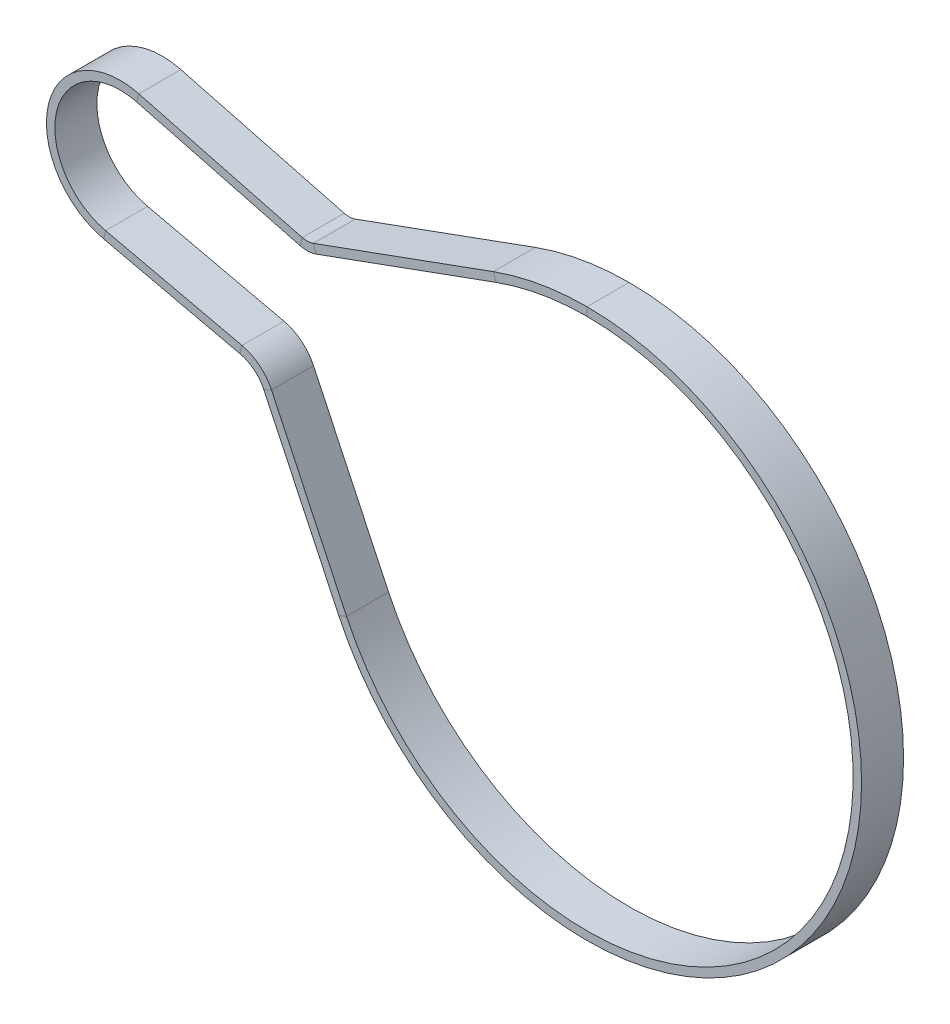
ISO-10303-21;
HEADER;
FILE_DESCRIPTION(('STEP AP214'),'2;1');
FILE_NAME('part.step','',(''),(''),'','','');
FILE_SCHEMA(('AUTOMOTIVE_DESIGN { 1 0 10303 214 1 1 1 1 }'));
ENDSEC;
DATA;
#1=APPLICATION_CONTEXT('core data for automotive mechanical design processes');
#2=APPLICATION_PROTOCOL_DEFINITION('international standard','automotive_design',2000,#1);
#3=PRODUCT_CONTEXT('',#1,'mechanical');
#4=PRODUCT('Part','Part','',(#3));
#5=PRODUCT_RELATED_PRODUCT_CATEGORY('part','',(#4));
#6=PRODUCT_DEFINITION_FORMATION('','',#4);
#7=PRODUCT_DEFINITION_CONTEXT('part definition',#1,'design');
#8=PRODUCT_DEFINITION('design','',#6,#7);
#9=PRODUCT_DEFINITION_SHAPE('','',#8);
#10=(LENGTH_UNIT() NAMED_UNIT(*) SI_UNIT(.MILLI.,.METRE.));
#11=(NAMED_UNIT(*) PLANE_ANGLE_UNIT() SI_UNIT($,.RADIAN.));
#12=(NAMED_UNIT(*) SI_UNIT($,.STERADIAN.) SOLID_ANGLE_UNIT());
#13=UNCERTAINTY_MEASURE_WITH_UNIT(LENGTH_MEASURE(1.E-05),#10,'distance_accuracy_value','');
#14=(GEOMETRIC_REPRESENTATION_CONTEXT(3) GLOBAL_UNCERTAINTY_ASSIGNED_CONTEXT((#13)) GLOBAL_UNIT_ASSIGNED_CONTEXT((#10,
#11,#12)) REPRESENTATION_CONTEXT('',''));
#15=CARTESIAN_POINT('',(0.,0.,0.));
#16=DIRECTION('',(0.,0.,1.));
#17=DIRECTION('',(1.,0.,0.));
#18=AXIS2_PLACEMENT_3D('',#15,#16,#17);
#19=CARTESIAN_POINT('',(-1.51201161036308E-13,1.83164142467635E-13,0.));
#20=DIRECTION('',(0.,0.,-1.));
#21=DIRECTION('',(-1.,0.,0.));
#22=AXIS2_PLACEMENT_3D('',#19,#20,#21);
#23=CYLINDRICAL_SURFACE('',#22,58.7999999999998);
#24=CARTESIAN_POINT('',(-1.51201161036308E-13,1.83164142467635E-13,-4.5));
#25=DIRECTION('',(0.,0.,-1.));
#26=DIRECTION('',(-0.341851057281934,0.939754145846255,0.));
#27=AXIS2_PLACEMENT_3D('',#24,#25,#26);
#28=CIRCLE('',#27,58.7999999999998);
#29=CARTESIAN_POINT('',(-20.1008421681778,55.2575437757598,-4.5));
#30=VERTEX_POINT('',#29);
#31=CARTESIAN_POINT('',(0.,58.8,-4.5));
#32=VERTEX_POINT('',#31);
#33=EDGE_CURVE('E11',#30,#32,#28,.T.);
#34=ORIENTED_EDGE('',*,*,#33,.F.);
#35=DIRECTION('',(0.,0.,1.));
#36=VECTOR('',#35,1.);
#37=CARTESIAN_POINT('',(-20.1008421681778,55.2575437757597,-4.5));
#38=LINE('',#37,#36);
#39=CARTESIAN_POINT('',(-20.1008421681778,55.2575437757598,4.5));
#40=VERTEX_POINT('',#39);
#41=EDGE_CURVE('E38',#30,#40,#38,.T.);
#42=ORIENTED_EDGE('',*,*,#41,.T.);
#43=CARTESIAN_POINT('',(-1.51201161036308E-13,1.83164142467635E-13,4.5));
#44=DIRECTION('',(0.,0.,-1.));
#45=DIRECTION('',(-0.341851057281934,0.939754145846255,0.));
#46=AXIS2_PLACEMENT_3D('',#43,#44,#45);
#47=CIRCLE('',#46,58.7999999999998);
#48=CARTESIAN_POINT('',(0.,58.8,4.5));
#49=VERTEX_POINT('',#48);
#50=EDGE_CURVE('E183',#40,#49,#47,.T.);
#51=ORIENTED_EDGE('',*,*,#50,.T.);
#52=DIRECTION('',(0.,0.,1.));
#53=VECTOR('',#52,1.);
#54=CARTESIAN_POINT('',(0.,58.8,-4.5));
#55=LINE('',#54,#53);
#56=EDGE_CURVE('E186',#32,#49,#55,.T.);
#57=ORIENTED_EDGE('',*,*,#56,.F.);
#58=EDGE_LOOP('',(#34,#42,#51,#57));
#59=FACE_BOUND('',#58,.T.);
#60=ADVANCED_FACE('F35',(#59),#23,.T.);
#61=CARTESIAN_POINT('',(-20.1008421681778,55.2575437757598,-4.5));
#62=DIRECTION('',(0.,0.,-1.));
#63=DIRECTION('',(-1.,0.,0.));
#64=AXIS2_PLACEMENT_3D('',#61,#62,#63);
#65=PLANE('',#64);
#66=CARTESIAN_POINT('',(-1.51201161036308E-13,1.83164142467635E-13,-4.5));
#67=DIRECTION('',(0.,0.,-1.));
#68=DIRECTION('',(-0.341851057281934,0.939754145846255,0.));
#69=AXIS2_PLACEMENT_3D('',#66,#67,#68);
#70=CIRCLE('',#69,56.9999999999998);
#71=CARTESIAN_POINT('',(-19.4855102650703,53.5659863132365,-4.5));
#72=VERTEX_POINT('',#71);
#73=CARTESIAN_POINT('',(0.,57.,-4.5));
#74=VERTEX_POINT('',#73);
#75=EDGE_CURVE('E43',#72,#74,#70,.T.);
#76=ORIENTED_EDGE('',*,*,#75,.F.);
#77=DIRECTION('',(-0.341851057281935,0.939754145846254,0.));
#78=VECTOR('',#77,1.);
#79=CARTESIAN_POINT('',(-20.1008421681778,55.2575437757597,-4.5));
#80=LINE('',#79,#78);
#81=EDGE_CURVE('E335',#72,#30,#80,.T.);
#82=ORIENTED_EDGE('',*,*,#81,.T.);
#83=ORIENTED_EDGE('',*,*,#33,.T.);
#84=DIRECTION('',(0.,1.,0.));
#85=VECTOR('',#84,1.);
#86=CARTESIAN_POINT('',(0.,58.8,-4.5));
#87=LINE('',#86,#85);
#88=EDGE_CURVE('E210',#74,#32,#87,.T.);
#89=ORIENTED_EDGE('',*,*,#88,.F.);
#90=EDGE_LOOP('',(#76,#82,#83,#89));
#91=FACE_BOUND('',#90,.T.);
#92=ADVANCED_FACE('F453',(#91),#65,.T.);
#93=CARTESIAN_POINT('',(-1.51201161036308E-13,1.83164142467635E-13,0.));
#94=DIRECTION('',(0.,0.,-1.));
#95=DIRECTION('',(-1.,0.,0.));
#96=AXIS2_PLACEMENT_3D('',#93,#94,#95);
#97=CYLINDRICAL_SURFACE('',#96,56.9999999999998);
#98=CARTESIAN_POINT('',(-1.51201161036308E-13,1.83164142467635E-13,4.5));
#99=DIRECTION('',(0.,0.,-1.));
#100=DIRECTION('',(-0.341851057281934,0.939754145846255,0.));
#101=AXIS2_PLACEMENT_3D('',#98,#99,#100);
#102=CIRCLE('',#101,56.9999999999998);
#103=CARTESIAN_POINT('',(-19.4855102650703,53.5659863132365,4.5));
#104=VERTEX_POINT('',#103);
#105=CARTESIAN_POINT('',(0.,57.,4.5));
#106=VERTEX_POINT('',#105);
#107=EDGE_CURVE('E192',#104,#106,#102,.T.);
#108=ORIENTED_EDGE('',*,*,#107,.F.);
#109=DIRECTION('',(0.,0.,-1.));
#110=VECTOR('',#109,1.);
#111=CARTESIAN_POINT('',(-19.4855102650703,53.5659863132365,4.5));
#112=LINE('',#111,#110);
#113=EDGE_CURVE('E291',#104,#72,#112,.T.);
#114=ORIENTED_EDGE('',*,*,#113,.T.);
#115=ORIENTED_EDGE('',*,*,#75,.T.);
#116=DIRECTION('',(0.,0.,-1.));
#117=VECTOR('',#116,1.);
#118=CARTESIAN_POINT('',(0.,57.,4.5));
#119=LINE('',#118,#117);
#120=EDGE_CURVE('E214',#106,#74,#119,.T.);
#121=ORIENTED_EDGE('',*,*,#120,.F.);
#122=EDGE_LOOP('',(#108,#114,#115,#121));
#123=FACE_BOUND('',#122,.T.);
#124=ADVANCED_FACE('F437',(#123),#97,.F.);
#125=CARTESIAN_POINT('',(-58.6325957708693,41.2409834166188,-4.5));
#126=DIRECTION('',(-0.341851057281933,0.939754145846255,0.));
#127=DIRECTION('',(-0.939754145846255,-0.341851057281933,0.));
#128=AXIS2_PLACEMENT_3D('',#125,#126,#127);
#129=PLANE('',#128);
#130=ORIENTED_EDGE('',*,*,#41,.F.);
#131=DIRECTION('',(0.939754145846255,0.341851057281933,0.));
#132=VECTOR('',#131,1.);
#133=CARTESIAN_POINT('',(-58.6325957708693,41.2409834166188,-4.5));
#134=LINE('',#133,#132);
#135=CARTESIAN_POINT('',(-58.6325957708693,41.2409834166188,-4.5));
#136=VERTEX_POINT('',#135);
#137=EDGE_CURVE('E104',#136,#30,#134,.T.);
#138=ORIENTED_EDGE('',*,*,#137,.F.);
#139=DIRECTION('',(0.,0.,1.));
#140=VECTOR('',#139,1.);
#141=CARTESIAN_POINT('',(-58.6325957708693,41.2409834166188,-4.5));
#142=LINE('',#141,#140);
#143=CARTESIAN_POINT('',(-58.6325957708693,41.2409834166188,4.5));
#144=VERTEX_POINT('',#143);
#145=EDGE_CURVE('E294',#136,#144,#142,.T.);
#146=ORIENTED_EDGE('',*,*,#145,.T.);
#147=DIRECTION('',(0.939754145846255,0.341851057281933,0.));
#148=VECTOR('',#147,1.);
#149=CARTESIAN_POINT('',(-58.6325957708693,41.2409834166188,4.5));
#150=LINE('',#149,#148);
#151=EDGE_CURVE('E289',#144,#40,#150,.T.);
#152=ORIENTED_EDGE('',*,*,#151,.T.);
#153=EDGE_LOOP('',(#130,#138,#146,#152));
#154=FACE_BOUND('',#153,.T.);
#155=ADVANCED_FACE('F383',(#154),#129,.T.);
#156=CARTESIAN_POINT('',(-58.6325957708693,41.2409834166188,-4.5));
#157=DIRECTION('',(0.,0.,-1.));
#158=DIRECTION('',(-1.,0.,0.));
#159=AXIS2_PLACEMENT_3D('',#156,#157,#158);
#160=PLANE('',#159);
#161=ORIENTED_EDGE('',*,*,#137,.T.);
#162=ORIENTED_EDGE('',*,*,#81,.F.);
#163=DIRECTION('',(0.939754145846255,0.341851057281933,0.));
#164=VECTOR('',#163,1.);
#165=CARTESIAN_POINT('',(-58.0172638677618,39.5494259540956,-4.5));
#166=LINE('',#165,#164);
#167=CARTESIAN_POINT('',(-58.0172638677618,39.5494259540956,-4.5));
#168=VERTEX_POINT('',#167);
#169=EDGE_CURVE('E113',#168,#72,#166,.T.);
#170=ORIENTED_EDGE('',*,*,#169,.F.);
#171=DIRECTION('',(-0.341851057281936,0.939754145846254,0.));
#172=VECTOR('',#171,1.);
#173=CARTESIAN_POINT('',(-58.6325957708693,41.2409834166188,-4.5));
#174=LINE('',#173,#172);
#175=EDGE_CURVE('E331',#168,#136,#174,.T.);
#176=ORIENTED_EDGE('',*,*,#175,.T.);
#177=EDGE_LOOP('',(#161,#162,#170,#176));
#178=FACE_BOUND('',#177,.T.);
#179=ADVANCED_FACE('F448',(#178),#160,.T.);
#180=CARTESIAN_POINT('',(-58.0172638677618,39.5494259540956,4.5));
#181=DIRECTION('',(0.341851057281933,-0.939754145846255,0.));
#182=DIRECTION('',(0.939754145846255,0.341851057281933,0.));
#183=AXIS2_PLACEMENT_3D('',#180,#181,#182);
#184=PLANE('',#183);
#185=ORIENTED_EDGE('',*,*,#169,.T.);
#186=ORIENTED_EDGE('',*,*,#113,.F.);
#187=DIRECTION('',(0.939754145846255,0.341851057281933,0.));
#188=VECTOR('',#187,1.);
#189=CARTESIAN_POINT('',(-58.0172638677618,39.5494259540956,4.5));
#190=LINE('',#189,#188);
#191=CARTESIAN_POINT('',(-58.0172638677618,39.5494259540956,4.5));
#192=VERTEX_POINT('',#191);
#193=EDGE_CURVE('E121',#192,#104,#190,.T.);
#194=ORIENTED_EDGE('',*,*,#193,.F.);
#195=DIRECTION('',(0.,0.,-1.));
#196=VECTOR('',#195,1.);
#197=CARTESIAN_POINT('',(-58.0172638677618,39.5494259540956,4.5));
#198=LINE('',#197,#196);
#199=EDGE_CURVE('E283',#192,#168,#198,.T.);
#200=ORIENTED_EDGE('',*,*,#199,.T.);
#201=EDGE_LOOP('',(#185,#186,#194,#200));
#202=FACE_BOUND('',#201,.T.);
#203=ADVANCED_FACE('F438',(#202),#184,.T.);
#204=CARTESIAN_POINT('',(-58.6325957708693,41.2409834166188,4.5));
#205=DIRECTION('',(0.,0.,1.));
#206=DIRECTION('',(1.,0.,0.));
#207=AXIS2_PLACEMENT_3D('',#204,#205,#206);
#208=PLANE('',#207);
#209=ORIENTED_EDGE('',*,*,#193,.T.);
#210=DIRECTION('',(0.341851057281935,-0.939754145846254,0.));
#211=VECTOR('',#210,1.);
#212=CARTESIAN_POINT('',(-20.1008421681778,55.2575437757597,4.5));
#213=LINE('',#212,#211);
#214=EDGE_CURVE('E287',#40,#104,#213,.T.);
#215=ORIENTED_EDGE('',*,*,#214,.F.);
#216=ORIENTED_EDGE('',*,*,#151,.F.);
#217=DIRECTION('',(0.341851057281936,-0.939754145846254,0.));
#218=VECTOR('',#217,1.);
#219=CARTESIAN_POINT('',(-58.6325957708693,41.2409834166188,4.5));
#220=LINE('',#219,#218);
#221=EDGE_CURVE('E278',#144,#192,#220,.T.);
#222=ORIENTED_EDGE('',*,*,#221,.T.);
#223=EDGE_LOOP('',(#209,#215,#216,#222));
#224=FACE_BOUND('',#223,.T.);
#225=ADVANCED_FACE('F439',(#224),#208,.T.);
#226=CARTESIAN_POINT('',(-59.9999999999971,45.000000000004,0.));
#227=DIRECTION('',(0.,0.,1.));
#228=DIRECTION('',(1.,0.,0.));
#229=AXIS2_PLACEMENT_3D('',#226,#227,#228);
#230=CYLINDRICAL_SURFACE('',#229,4.00000000000017);
#231=ORIENTED_EDGE('',*,*,#145,.F.);
#232=CARTESIAN_POINT('',(-59.9999999999971,45.000000000004,-4.5));
#233=DIRECTION('',(0.,0.,1.));
#234=DIRECTION('',(-0.253142766855412,-0.967428932577885,0.));
#235=AXIS2_PLACEMENT_3D('',#232,#233,#234);
#236=CIRCLE('',#235,4.00000000000017);
#237=CARTESIAN_POINT('',(-61.0125710674188,41.1302842696923,-4.5));
#238=VERTEX_POINT('',#237);
#239=EDGE_CURVE('E366',#238,#136,#236,.T.);
#240=ORIENTED_EDGE('',*,*,#239,.F.);
#241=DIRECTION('',(0.,0.,1.));
#242=VECTOR('',#241,1.);
#243=CARTESIAN_POINT('',(-61.0125710674188,41.1302842696923,-4.5));
#244=LINE('',#243,#242);
#245=CARTESIAN_POINT('',(-61.0125710674188,41.1302842696923,4.5));
#246=VERTEX_POINT('',#245);
#247=EDGE_CURVE('E286',#238,#246,#244,.T.);
#248=ORIENTED_EDGE('',*,*,#247,.T.);
#249=CARTESIAN_POINT('',(-59.9999999999971,45.000000000004,4.5));
#250=DIRECTION('',(0.,0.,1.));
#251=DIRECTION('',(-0.253142766855412,-0.967428932577885,0.));
#252=AXIS2_PLACEMENT_3D('',#249,#250,#251);
#253=CIRCLE('',#252,4.00000000000017);
#254=EDGE_CURVE('E281',#246,#144,#253,.T.);
#255=ORIENTED_EDGE('',*,*,#254,.T.);
#256=EDGE_LOOP('',(#231,#240,#248,#255));
#257=FACE_BOUND('',#256,.T.);
#258=ADVANCED_FACE('F388',(#257),#230,.F.);
#259=CARTESIAN_POINT('',(-61.0125710674188,41.1302842696923,-4.5));
#260=DIRECTION('',(0.,0.,-1.));
#261=DIRECTION('',(-1.,0.,0.));
#262=AXIS2_PLACEMENT_3D('',#259,#260,#261);
#263=PLANE('',#262);
#264=ORIENTED_EDGE('',*,*,#239,.T.);
#265=ORIENTED_EDGE('',*,*,#175,.F.);
#266=CARTESIAN_POINT('',(-59.9999999999971,45.000000000004,-4.5));
#267=DIRECTION('',(0.,0.,1.));
#268=DIRECTION('',(-0.253142766855411,-0.967428932577886,0.));
#269=AXIS2_PLACEMENT_3D('',#266,#267,#268);
#270=CIRCLE('',#269,5.80000000000018);
#271=CARTESIAN_POINT('',(-61.4682280477585,39.3889121910521,-4.5));
#272=VERTEX_POINT('',#271);
#273=EDGE_CURVE('E148',#272,#168,#270,.T.);
#274=ORIENTED_EDGE('',*,*,#273,.F.);
#275=DIRECTION('',(0.253142766855411,0.967428932577886,0.));
#276=VECTOR('',#275,1.);
#277=CARTESIAN_POINT('',(-61.0125710674188,41.1302842696923,-4.5));
#278=LINE('',#277,#276);
#279=EDGE_CURVE('E328',#272,#238,#278,.T.);
#280=ORIENTED_EDGE('',*,*,#279,.T.);
#281=EDGE_LOOP('',(#264,#265,#274,#280));
#282=FACE_BOUND('',#281,.T.);
#283=ADVANCED_FACE('F446',(#282),#263,.T.);
#284=CARTESIAN_POINT('',(-59.9999999999971,45.000000000004,0.));
#285=DIRECTION('',(0.,0.,1.));
#286=DIRECTION('',(1.,0.,0.));
#287=AXIS2_PLACEMENT_3D('',#284,#285,#286);
#288=CYLINDRICAL_SURFACE('',#287,5.80000000000018);
#289=ORIENTED_EDGE('',*,*,#273,.T.);
#290=ORIENTED_EDGE('',*,*,#199,.F.);
#291=CARTESIAN_POINT('',(-59.9999999999971,45.000000000004,4.5));
#292=DIRECTION('',(0.,0.,1.));
#293=DIRECTION('',(-0.253142766855411,-0.967428932577886,0.));
#294=AXIS2_PLACEMENT_3D('',#291,#292,#293);
#295=CIRCLE('',#294,5.80000000000018);
#296=CARTESIAN_POINT('',(-61.4682280477585,39.3889121910521,4.5));
#297=VERTEX_POINT('',#296);
#298=EDGE_CURVE('E154',#297,#192,#295,.T.);
#299=ORIENTED_EDGE('',*,*,#298,.F.);
#300=DIRECTION('',(0.,0.,-1.));
#301=VECTOR('',#300,1.);
#302=CARTESIAN_POINT('',(-61.4682280477585,39.3889121910521,4.5));
#303=LINE('',#302,#301);
#304=EDGE_CURVE('E274',#297,#272,#303,.T.);
#305=ORIENTED_EDGE('',*,*,#304,.T.);
#306=EDGE_LOOP('',(#289,#290,#299,#305));
#307=FACE_BOUND('',#306,.T.);
#308=ADVANCED_FACE('F486',(#307),#288,.T.);
#309=CARTESIAN_POINT('',(-61.0125710674188,41.1302842696923,4.5));
#310=DIRECTION('',(0.,0.,1.));
#311=DIRECTION('',(1.,0.,0.));
#312=AXIS2_PLACEMENT_3D('',#309,#310,#311);
#313=PLANE('',#312);
#314=ORIENTED_EDGE('',*,*,#298,.T.);
#315=ORIENTED_EDGE('',*,*,#221,.F.);
#316=ORIENTED_EDGE('',*,*,#254,.F.);
#317=DIRECTION('',(-0.253142766855411,-0.967428932577886,0.));
#318=VECTOR('',#317,1.);
#319=CARTESIAN_POINT('',(-61.0125710674188,41.1302842696923,4.5));
#320=LINE('',#319,#318);
#321=EDGE_CURVE('E267',#246,#297,#320,.T.);
#322=ORIENTED_EDGE('',*,*,#321,.T.);
#323=EDGE_LOOP('',(#314,#315,#316,#322));
#324=FACE_BOUND('',#323,.T.);
#325=ADVANCED_FACE('F386',(#324),#313,.T.);
#326=CARTESIAN_POINT('',(-96.0003442836845,50.2853771347304,-4.5));
#327=DIRECTION('',(0.253142766855414,0.967428932577885,0.));
#328=DIRECTION('',(-0.967428932577885,0.253142766855414,0.));
#329=AXIS2_PLACEMENT_3D('',#326,#327,#328);
#330=PLANE('',#329);
#331=ORIENTED_EDGE('',*,*,#247,.F.);
#332=DIRECTION('',(0.967428932577885,-0.253142766855414,0.));
#333=VECTOR('',#332,1.);
#334=CARTESIAN_POINT('',(-96.0003442836845,50.2853771347304,-4.5));
#335=LINE('',#334,#333);
#336=CARTESIAN_POINT('',(-96.0003442836846,50.2853771347304,-4.5));
#337=VERTEX_POINT('',#336);
#338=EDGE_CURVE('E362',#337,#238,#335,.T.);
#339=ORIENTED_EDGE('',*,*,#338,.F.);
#340=DIRECTION('',(0.,0.,1.));
#341=VECTOR('',#340,1.);
#342=CARTESIAN_POINT('',(-96.0003442836846,50.2853771347304,-4.5));
#343=LINE('',#342,#341);
#344=CARTESIAN_POINT('',(-96.0003442836846,50.2853771347304,4.5));
#345=VERTEX_POINT('',#344);
#346=EDGE_CURVE('E277',#337,#345,#343,.T.);
#347=ORIENTED_EDGE('',*,*,#346,.T.);
#348=DIRECTION('',(0.967428932577885,-0.253142766855414,0.));
#349=VECTOR('',#348,1.);
#350=CARTESIAN_POINT('',(-96.0003442836845,50.2853771347304,4.5));
#351=LINE('',#350,#349);
#352=EDGE_CURVE('E271',#345,#246,#351,.T.);
#353=ORIENTED_EDGE('',*,*,#352,.T.);
#354=EDGE_LOOP('',(#331,#339,#347,#353));
#355=FACE_BOUND('',#354,.T.);
#356=ADVANCED_FACE('F394',(#355),#330,.T.);
#357=CARTESIAN_POINT('',(-96.0003442836845,50.2853771347304,-4.5));
#358=DIRECTION('',(0.,0.,-1.));
#359=DIRECTION('',(-1.,0.,0.));
#360=AXIS2_PLACEMENT_3D('',#357,#358,#359);
#361=PLANE('',#360);
#362=ORIENTED_EDGE('',*,*,#338,.T.);
#363=ORIENTED_EDGE('',*,*,#279,.F.);
#364=DIRECTION('',(0.967428932577885,-0.253142766855414,0.));
#365=VECTOR('',#364,1.);
#366=CARTESIAN_POINT('',(-96.4560012640243,48.5440050560902,-4.5));
#367=LINE('',#366,#365);
#368=CARTESIAN_POINT('',(-96.4560012640243,48.5440050560902,-4.5));
#369=VERTEX_POINT('',#368);
#370=EDGE_CURVE('E325',#369,#272,#367,.T.);
#371=ORIENTED_EDGE('',*,*,#370,.F.);
#372=DIRECTION('',(0.253142766855412,0.967428932577885,0.));
#373=VECTOR('',#372,1.);
#374=CARTESIAN_POINT('',(-96.0003442836846,50.2853771347304,-4.5));
#375=LINE('',#374,#373);
#376=EDGE_CURVE('E323',#369,#337,#375,.T.);
#377=ORIENTED_EDGE('',*,*,#376,.T.);
#378=EDGE_LOOP('',(#362,#363,#371,#377));
#379=FACE_BOUND('',#378,.T.);
#380=ADVANCED_FACE('F479',(#379),#361,.T.);
#381=CARTESIAN_POINT('',(-96.4560012640243,48.5440050560902,4.5));
#382=DIRECTION('',(-0.253142766855414,-0.967428932577885,0.));
#383=DIRECTION('',(0.967428932577885,-0.253142766855414,0.));
#384=AXIS2_PLACEMENT_3D('',#381,#382,#383);
#385=PLANE('',#384);
#386=ORIENTED_EDGE('',*,*,#370,.T.);
#387=ORIENTED_EDGE('',*,*,#304,.F.);
#388=DIRECTION('',(0.967428932577885,-0.253142766855414,0.));
#389=VECTOR('',#388,1.);
#390=CARTESIAN_POINT('',(-96.4560012640243,48.5440050560902,4.5));
#391=LINE('',#390,#389);
#392=CARTESIAN_POINT('',(-96.4560012640243,48.5440050560902,4.5));
#393=VERTEX_POINT('',#392);
#394=EDGE_CURVE('E270',#393,#297,#391,.T.);
#395=ORIENTED_EDGE('',*,*,#394,.F.);
#396=DIRECTION('',(0.,0.,-1.));
#397=VECTOR('',#396,1.);
#398=CARTESIAN_POINT('',(-96.4560012640243,48.5440050560902,4.5));
#399=LINE('',#398,#397);
#400=EDGE_CURVE('E263',#393,#369,#399,.T.);
#401=ORIENTED_EDGE('',*,*,#400,.T.);
#402=EDGE_LOOP('',(#386,#387,#395,#401));
#403=FACE_BOUND('',#402,.T.);
#404=ADVANCED_FACE('F488',(#403),#385,.T.);
#405=CARTESIAN_POINT('',(-96.0003442836845,50.2853771347304,4.5));
#406=DIRECTION('',(0.,0.,1.));
#407=DIRECTION('',(1.,0.,0.));
#408=AXIS2_PLACEMENT_3D('',#405,#406,#407);
#409=PLANE('',#408);
#410=ORIENTED_EDGE('',*,*,#394,.T.);
#411=ORIENTED_EDGE('',*,*,#321,.F.);
#412=ORIENTED_EDGE('',*,*,#352,.F.);
#413=DIRECTION('',(-0.253142766855412,-0.967428932577885,0.));
#414=VECTOR('',#413,1.);
#415=CARTESIAN_POINT('',(-96.0003442836846,50.2853771347304,4.5));
#416=LINE('',#415,#414);
#417=EDGE_CURVE('E256',#345,#393,#416,.T.);
#418=ORIENTED_EDGE('',*,*,#417,.T.);
#419=EDGE_LOOP('',(#410,#411,#412,#418));
#420=FACE_BOUND('',#419,.T.);
#421=ADVANCED_FACE('F393',(#420),#409,.T.);
#422=CARTESIAN_POINT('',(-100.,35.,0.));
#423=DIRECTION('',(0.,0.,-1.));
#424=DIRECTION('',(-1.,0.,0.));
#425=AXIS2_PLACEMENT_3D('',#422,#423,#424);
#426=CYLINDRICAL_SURFACE('',#425,15.7999999999998);
#427=ORIENTED_EDGE('',*,*,#346,.F.);
#428=CARTESIAN_POINT('',(-100.,35.,-4.5));
#429=DIRECTION('',(0.,0.,-1.));
#430=DIRECTION('',(-0.223565345653823,-0.974688943316116,0.));
#431=AXIS2_PLACEMENT_3D('',#428,#429,#430);
#432=CIRCLE('',#431,15.7999999999998);
#433=CARTESIAN_POINT('',(-103.53233246133,19.5999146956056,-4.5));
#434=VERTEX_POINT('',#433);
#435=EDGE_CURVE('E358',#434,#337,#432,.T.);
#436=ORIENTED_EDGE('',*,*,#435,.F.);
#437=DIRECTION('',(0.,0.,1.));
#438=VECTOR('',#437,1.);
#439=CARTESIAN_POINT('',(-103.53233246133,19.5999146956056,-4.5));
#440=LINE('',#439,#438);
#441=CARTESIAN_POINT('',(-103.53233246133,19.5999146956056,4.5));
#442=VERTEX_POINT('',#441);
#443=EDGE_CURVE('E266',#434,#442,#440,.T.);
#444=ORIENTED_EDGE('',*,*,#443,.T.);
#445=CARTESIAN_POINT('',(-100.,35.,4.5));
#446=DIRECTION('',(0.,0.,-1.));
#447=DIRECTION('',(-0.223565345653823,-0.974688943316116,0.));
#448=AXIS2_PLACEMENT_3D('',#445,#446,#447);
#449=CIRCLE('',#448,15.7999999999998);
#450=EDGE_CURVE('E260',#442,#345,#449,.T.);
#451=ORIENTED_EDGE('',*,*,#450,.T.);
#452=EDGE_LOOP('',(#427,#436,#444,#451));
#453=FACE_BOUND('',#452,.T.);
#454=ADVANCED_FACE('F400',(#453),#426,.T.);
#455=CARTESIAN_POINT('',(-103.53233246133,19.5999146956056,-4.5));
#456=DIRECTION('',(0.,0.,-1.));
#457=DIRECTION('',(-1.,0.,0.));
#458=AXIS2_PLACEMENT_3D('',#455,#456,#457);
#459=PLANE('',#458);
#460=ORIENTED_EDGE('',*,*,#435,.T.);
#461=ORIENTED_EDGE('',*,*,#376,.F.);
#462=CARTESIAN_POINT('',(-100.,35.,-4.5));
#463=DIRECTION('',(0.,0.,-1.));
#464=DIRECTION('',(-0.223565345653823,-0.974688943316116,0.));
#465=AXIS2_PLACEMENT_3D('',#462,#463,#464);
#466=CIRCLE('',#465,13.9999999999998);
#467=CARTESIAN_POINT('',(-103.129914839154,21.3543547935746,-4.5));
#468=VERTEX_POINT('',#467);
#469=EDGE_CURVE('E320',#468,#369,#466,.T.);
#470=ORIENTED_EDGE('',*,*,#469,.F.);
#471=DIRECTION('',(-0.223565345653819,-0.974688943316117,0.));
#472=VECTOR('',#471,1.);
#473=CARTESIAN_POINT('',(-103.53233246133,19.5999146956056,-4.5));
#474=LINE('',#473,#472);
#475=EDGE_CURVE('E317',#468,#434,#474,.T.);
#476=ORIENTED_EDGE('',*,*,#475,.T.);
#477=EDGE_LOOP('',(#460,#461,#470,#476));
#478=FACE_BOUND('',#477,.T.);
#479=ADVANCED_FACE('F477',(#478),#459,.T.);
#480=CARTESIAN_POINT('',(-100.,35.,0.));
#481=DIRECTION('',(0.,0.,-1.));
#482=DIRECTION('',(-1.,0.,0.));
#483=AXIS2_PLACEMENT_3D('',#480,#481,#482);
#484=CYLINDRICAL_SURFACE('',#483,13.9999999999998);
#485=ORIENTED_EDGE('',*,*,#469,.T.);
#486=ORIENTED_EDGE('',*,*,#400,.F.);
#487=CARTESIAN_POINT('',(-100.,35.,4.5));
#488=DIRECTION('',(0.,0.,-1.));
#489=DIRECTION('',(-0.223565345653823,-0.974688943316116,0.));
#490=AXIS2_PLACEMENT_3D('',#487,#488,#489);
#491=CIRCLE('',#490,13.9999999999998);
#492=CARTESIAN_POINT('',(-103.129914839154,21.3543547935746,4.5));
#493=VERTEX_POINT('',#492);
#494=EDGE_CURVE('E259',#493,#393,#491,.T.);
#495=ORIENTED_EDGE('',*,*,#494,.F.);
#496=DIRECTION('',(0.,0.,-1.));
#497=VECTOR('',#496,1.);
#498=CARTESIAN_POINT('',(-103.129914839154,21.3543547935746,4.5));
#499=LINE('',#498,#497);
#500=EDGE_CURVE('E252',#493,#468,#499,.T.);
#501=ORIENTED_EDGE('',*,*,#500,.T.);
#502=EDGE_LOOP('',(#485,#486,#495,#501));
#503=FACE_BOUND('',#502,.T.);
#504=ADVANCED_FACE('F495',(#503),#484,.F.);
#505=CARTESIAN_POINT('',(-103.53233246133,19.5999146956056,4.5));
#506=DIRECTION('',(0.,0.,1.));
#507=DIRECTION('',(1.,0.,0.));
#508=AXIS2_PLACEMENT_3D('',#505,#506,#507);
#509=PLANE('',#508);
#510=ORIENTED_EDGE('',*,*,#494,.T.);
#511=ORIENTED_EDGE('',*,*,#417,.F.);
#512=ORIENTED_EDGE('',*,*,#450,.F.);
#513=DIRECTION('',(0.223565345653819,0.974688943316117,0.));
#514=VECTOR('',#513,1.);
#515=CARTESIAN_POINT('',(-103.53233246133,19.5999146956056,4.5));
#516=LINE('',#515,#514);
#517=EDGE_CURVE('E245',#442,#493,#516,.T.);
#518=ORIENTED_EDGE('',*,*,#517,.T.);
#519=EDGE_LOOP('',(#510,#511,#512,#518));
#520=FACE_BOUND('',#519,.T.);
#521=ADVANCED_FACE('F399',(#520),#509,.T.);
#522=CARTESIAN_POINT('',(-74.3232599076017,12.9002014727543,-4.5));
#523=DIRECTION('',(-0.223565345653821,-0.974688943316116,0.));
#524=DIRECTION('',(0.974688943316116,-0.223565345653821,0.));
#525=AXIS2_PLACEMENT_3D('',#522,#523,#524);
#526=PLANE('',#525);
#527=ORIENTED_EDGE('',*,*,#443,.F.);
#528=DIRECTION('',(-0.974688943316116,0.223565345653821,0.));
#529=VECTOR('',#528,1.);
#530=CARTESIAN_POINT('',(-74.3232599076017,12.9002014727543,-4.5));
#531=LINE('',#530,#529);
#532=CARTESIAN_POINT('',(-74.3232599076017,12.9002014727543,-4.5));
#533=VERTEX_POINT('',#532);
#534=EDGE_CURVE('E353',#533,#434,#531,.T.);
#535=ORIENTED_EDGE('',*,*,#534,.F.);
#536=DIRECTION('',(0.,0.,1.));
#537=VECTOR('',#536,1.);
#538=CARTESIAN_POINT('',(-74.3232599076017,12.9002014727543,-4.5));
#539=LINE('',#538,#537);
#540=CARTESIAN_POINT('',(-74.3232599076017,12.9002014727543,4.5));
#541=VERTEX_POINT('',#540);
#542=EDGE_CURVE('E255',#533,#541,#539,.T.);
#543=ORIENTED_EDGE('',*,*,#542,.T.);
#544=DIRECTION('',(-0.974688943316116,0.223565345653821,0.));
#545=VECTOR('',#544,1.);
#546=CARTESIAN_POINT('',(-74.3232599076017,12.9002014727543,4.5));
#547=LINE('',#546,#545);
#548=EDGE_CURVE('E249',#541,#442,#547,.T.);
#549=ORIENTED_EDGE('',*,*,#548,.T.);
#550=EDGE_LOOP('',(#527,#535,#543,#549));
#551=FACE_BOUND('',#550,.T.);
#552=ADVANCED_FACE('F406',(#551),#526,.T.);
#553=CARTESIAN_POINT('',(-74.3232599076017,12.9002014727543,-4.5));
#554=DIRECTION('',(0.,0.,-1.));
#555=DIRECTION('',(-1.,0.,0.));
#556=AXIS2_PLACEMENT_3D('',#553,#554,#555);
#557=PLANE('',#556);
#558=ORIENTED_EDGE('',*,*,#534,.T.);
#559=ORIENTED_EDGE('',*,*,#475,.F.);
#560=DIRECTION('',(-0.974688943316116,0.223565345653821,0.));
#561=VECTOR('',#560,1.);
#562=CARTESIAN_POINT('',(-73.9208422854249,14.6546415707233,-4.5));
#563=LINE('',#562,#561);
#564=CARTESIAN_POINT('',(-73.9208422854249,14.6546415707233,-4.5));
#565=VERTEX_POINT('',#564);
#566=EDGE_CURVE('E314',#565,#468,#563,.T.);
#567=ORIENTED_EDGE('',*,*,#566,.F.);
#568=DIRECTION('',(-0.22356534565382,-0.974688943316117,0.));
#569=VECTOR('',#568,1.);
#570=CARTESIAN_POINT('',(-74.3232599076017,12.9002014727543,-4.5));
#571=LINE('',#570,#569);
#572=EDGE_CURVE('E311',#565,#533,#571,.T.);
#573=ORIENTED_EDGE('',*,*,#572,.T.);
#574=EDGE_LOOP('',(#558,#559,#567,#573));
#575=FACE_BOUND('',#574,.T.);
#576=ADVANCED_FACE('F474',(#575),#557,.T.);
#577=CARTESIAN_POINT('',(-73.9208422854249,14.6546415707233,4.5));
#578=DIRECTION('',(0.223565345653821,0.974688943316116,0.));
#579=DIRECTION('',(-0.974688943316116,0.223565345653821,0.));
#580=AXIS2_PLACEMENT_3D('',#577,#578,#579);
#581=PLANE('',#580);
#582=ORIENTED_EDGE('',*,*,#566,.T.);
#583=ORIENTED_EDGE('',*,*,#500,.F.);
#584=DIRECTION('',(-0.974688943316116,0.223565345653821,0.));
#585=VECTOR('',#584,1.);
#586=CARTESIAN_POINT('',(-73.9208422854249,14.6546415707233,4.5));
#587=LINE('',#586,#585);
#588=CARTESIAN_POINT('',(-73.9208422854249,14.6546415707233,4.5));
#589=VERTEX_POINT('',#588);
#590=EDGE_CURVE('E248',#589,#493,#587,.T.);
#591=ORIENTED_EDGE('',*,*,#590,.F.);
#592=DIRECTION('',(0.,0.,-1.));
#593=VECTOR('',#592,1.);
#594=CARTESIAN_POINT('',(-73.9208422854249,14.6546415707233,4.5));
#595=LINE('',#594,#593);
#596=EDGE_CURVE('E241',#589,#565,#595,.T.);
#597=ORIENTED_EDGE('',*,*,#596,.T.);
#598=EDGE_LOOP('',(#582,#583,#591,#597));
#599=FACE_BOUND('',#598,.T.);
#600=ADVANCED_FACE('F498',(#599),#581,.T.);
#601=CARTESIAN_POINT('',(-74.3232599076017,12.9002014727543,4.5));
#602=DIRECTION('',(0.,0.,1.));
#603=DIRECTION('',(1.,0.,0.));
#604=AXIS2_PLACEMENT_3D('',#601,#602,#603);
#605=PLANE('',#604);
#606=ORIENTED_EDGE('',*,*,#590,.T.);
#607=ORIENTED_EDGE('',*,*,#517,.F.);
#608=ORIENTED_EDGE('',*,*,#548,.F.);
#609=DIRECTION('',(0.22356534565382,0.974688943316117,0.));
#610=VECTOR('',#609,1.);
#611=CARTESIAN_POINT('',(-74.3232599076017,12.9002014727543,4.5));
#612=LINE('',#611,#610);
#613=EDGE_CURVE('E234',#541,#589,#612,.T.);
#614=ORIENTED_EDGE('',*,*,#613,.T.);
#615=EDGE_LOOP('',(#606,#607,#608,#614));
#616=FACE_BOUND('',#615,.T.);
#617=ADVANCED_FACE('F405',(#616),#605,.T.);
#618=CARTESIAN_POINT('',(-76.0000000000054,5.59003439788326,0.));
#619=DIRECTION('',(0.,0.,1.));
#620=DIRECTION('',(1.,0.,0.));
#621=AXIS2_PLACEMENT_3D('',#618,#619,#620);
#622=CYLINDRICAL_SURFACE('',#621,7.50000000000018);
#623=ORIENTED_EDGE('',*,*,#542,.F.);
#624=CARTESIAN_POINT('',(-76.0000000000054,5.59003439788326,-4.5));
#625=DIRECTION('',(0.,0.,1.));
#626=DIRECTION('',(0.903839674272049,0.427871292811047,0.));
#627=AXIS2_PLACEMENT_3D('',#624,#625,#626);
#628=CIRCLE('',#627,7.50000000000018);
#629=CARTESIAN_POINT('',(-69.221202442965,8.79906909396614,-4.5));
#630=VERTEX_POINT('',#629);
#631=EDGE_CURVE('E348',#630,#533,#628,.T.);
#632=ORIENTED_EDGE('',*,*,#631,.F.);
#633=DIRECTION('',(0.,0.,1.));
#634=VECTOR('',#633,1.);
#635=CARTESIAN_POINT('',(-69.2212024429649,8.7990690939662,-4.5));
#636=LINE('',#635,#634);
#637=CARTESIAN_POINT('',(-69.221202442965,8.79906909396614,4.5));
#638=VERTEX_POINT('',#637);
#639=EDGE_CURVE('E244',#630,#638,#636,.T.);
#640=ORIENTED_EDGE('',*,*,#639,.T.);
#641=CARTESIAN_POINT('',(-76.0000000000054,5.59003439788326,4.5));
#642=DIRECTION('',(0.,0.,1.));
#643=DIRECTION('',(0.903839674272049,0.427871292811047,0.));
#644=AXIS2_PLACEMENT_3D('',#641,#642,#643);
#645=CIRCLE('',#644,7.50000000000018);
#646=EDGE_CURVE('E238',#638,#541,#645,.T.);
#647=ORIENTED_EDGE('',*,*,#646,.T.);
#648=EDGE_LOOP('',(#623,#632,#640,#647));
#649=FACE_BOUND('',#648,.T.);
#650=ADVANCED_FACE('F412',(#649),#622,.F.);
#651=CARTESIAN_POINT('',(-69.2212024429649,8.7990690939662,-4.5));
#652=DIRECTION('',(0.,0.,-1.));
#653=DIRECTION('',(-1.,0.,0.));
#654=AXIS2_PLACEMENT_3D('',#651,#652,#653);
#655=PLANE('',#654);
#656=ORIENTED_EDGE('',*,*,#631,.T.);
#657=ORIENTED_EDGE('',*,*,#572,.F.);
#658=CARTESIAN_POINT('',(-76.0000000000054,5.59003439788326,-4.5));
#659=DIRECTION('',(0.,0.,1.));
#660=DIRECTION('',(0.903839674272048,0.427871292811048,0.));
#661=AXIS2_PLACEMENT_3D('',#658,#659,#660);
#662=CIRCLE('',#661,9.30000000000018);
#663=CARTESIAN_POINT('',(-67.5942910292753,9.56923742102604,-4.5));
#664=VERTEX_POINT('',#663);
#665=EDGE_CURVE('E308',#664,#565,#662,.T.);
#666=ORIENTED_EDGE('',*,*,#665,.F.);
#667=DIRECTION('',(-0.903839674272048,-0.42787129281105,0.));
#668=VECTOR('',#667,1.);
#669=CARTESIAN_POINT('',(-69.2212024429649,8.7990690939662,-4.5));
#670=LINE('',#669,#668);
#671=EDGE_CURVE('E305',#664,#630,#670,.T.);
#672=ORIENTED_EDGE('',*,*,#671,.T.);
#673=EDGE_LOOP('',(#656,#657,#666,#672));
#674=FACE_BOUND('',#673,.T.);
#675=ADVANCED_FACE('F471',(#674),#655,.T.);
#676=CARTESIAN_POINT('',(-76.0000000000054,5.59003439788326,0.));
#677=DIRECTION('',(0.,0.,1.));
#678=DIRECTION('',(1.,0.,0.));
#679=AXIS2_PLACEMENT_3D('',#676,#677,#678);
#680=CYLINDRICAL_SURFACE('',#679,9.30000000000018);
#681=ORIENTED_EDGE('',*,*,#665,.T.);
#682=ORIENTED_EDGE('',*,*,#596,.F.);
#683=CARTESIAN_POINT('',(-76.0000000000054,5.59003439788326,4.5));
#684=DIRECTION('',(0.,0.,1.));
#685=DIRECTION('',(0.903839674272048,0.427871292811048,0.));
#686=AXIS2_PLACEMENT_3D('',#683,#684,#685);
#687=CIRCLE('',#686,9.30000000000018);
#688=CARTESIAN_POINT('',(-67.5942910292753,9.56923742102604,4.5));
#689=VERTEX_POINT('',#688);
#690=EDGE_CURVE('E237',#689,#589,#687,.T.);
#691=ORIENTED_EDGE('',*,*,#690,.F.);
#692=DIRECTION('',(0.,0.,-1.));
#693=VECTOR('',#692,1.);
#694=CARTESIAN_POINT('',(-67.5942910292752,9.56923742102609,4.5));
#695=LINE('',#694,#693);
#696=EDGE_CURVE('E230',#689,#664,#695,.T.);
#697=ORIENTED_EDGE('',*,*,#696,.T.);
#698=EDGE_LOOP('',(#681,#682,#691,#697));
#699=FACE_BOUND('',#698,.T.);
#700=ADVANCED_FACE('F504',(#699),#680,.T.);
#701=CARTESIAN_POINT('',(-69.2212024429649,8.7990690939662,4.5));
#702=DIRECTION('',(0.,0.,1.));
#703=DIRECTION('',(1.,0.,0.));
#704=AXIS2_PLACEMENT_3D('',#701,#702,#703);
#705=PLANE('',#704);
#706=ORIENTED_EDGE('',*,*,#690,.T.);
#707=ORIENTED_EDGE('',*,*,#613,.F.);
#708=ORIENTED_EDGE('',*,*,#646,.F.);
#709=DIRECTION('',(0.903839674272048,0.42787129281105,0.));
#710=VECTOR('',#709,1.);
#711=CARTESIAN_POINT('',(-69.2212024429649,8.7990690939662,4.5));
#712=LINE('',#711,#710);
#713=EDGE_CURVE('E223',#638,#689,#712,.T.);
#714=ORIENTED_EDGE('',*,*,#713,.T.);
#715=EDGE_LOOP('',(#706,#707,#708,#714));
#716=FACE_BOUND('',#715,.T.);
#717=ADVANCED_FACE('F411',(#716),#705,.T.);
#718=CARTESIAN_POINT('',(-53.1457728471964,-25.1588320172897,-4.5));
#719=DIRECTION('',(-0.903839674272049,-0.427871292811047,0.));
#720=DIRECTION('',(0.427871292811047,-0.903839674272049,0.));
#721=AXIS2_PLACEMENT_3D('',#718,#719,#720);
#722=PLANE('',#721);
#723=ORIENTED_EDGE('',*,*,#639,.F.);
#724=DIRECTION('',(-0.427871292811047,0.903839674272049,0.));
#725=VECTOR('',#724,1.);
#726=CARTESIAN_POINT('',(-53.1457728471964,-25.1588320172897,-4.5));
#727=LINE('',#726,#725);
#728=CARTESIAN_POINT('',(-53.1457728471963,-25.1588320172897,-4.5));
#729=VERTEX_POINT('',#728);
#730=EDGE_CURVE('E343',#729,#630,#727,.T.);
#731=ORIENTED_EDGE('',*,*,#730,.F.);
#732=DIRECTION('',(0.,0.,1.));
#733=VECTOR('',#732,1.);
#734=CARTESIAN_POINT('',(-53.1457728471964,-25.1588320172898,-4.5));
#735=LINE('',#734,#733);
#736=CARTESIAN_POINT('',(-53.1457728471963,-25.1588320172897,4.5));
#737=VERTEX_POINT('',#736);
#738=EDGE_CURVE('E233',#729,#737,#735,.T.);
#739=ORIENTED_EDGE('',*,*,#738,.T.);
#740=DIRECTION('',(-0.427871292811047,0.903839674272049,0.));
#741=VECTOR('',#740,1.);
#742=CARTESIAN_POINT('',(-53.1457728471964,-25.1588320172897,4.5));
#743=LINE('',#742,#741);
#744=EDGE_CURVE('E227',#737,#638,#743,.T.);
#745=ORIENTED_EDGE('',*,*,#744,.T.);
#746=EDGE_LOOP('',(#723,#731,#739,#745));
#747=FACE_BOUND('',#746,.T.);
#748=ADVANCED_FACE('F420',(#747),#722,.T.);
#749=CARTESIAN_POINT('',(-53.1457728471964,-25.1588320172897,-4.5));
#750=DIRECTION('',(0.,0.,-1.));
#751=DIRECTION('',(-1.,0.,0.));
#752=AXIS2_PLACEMENT_3D('',#749,#750,#751);
#753=PLANE('',#752);
#754=ORIENTED_EDGE('',*,*,#730,.T.);
#755=ORIENTED_EDGE('',*,*,#671,.F.);
#756=DIRECTION('',(-0.427871292811047,0.903839674272049,0.));
#757=VECTOR('',#756,1.);
#758=CARTESIAN_POINT('',(-51.5188614335067,-24.3886636902298,-4.5));
#759=LINE('',#758,#757);
#760=CARTESIAN_POINT('',(-51.5188614335066,-24.3886636902298,-4.5));
#761=VERTEX_POINT('',#760);
#762=EDGE_CURVE('E302',#761,#664,#759,.T.);
#763=ORIENTED_EDGE('',*,*,#762,.F.);
#764=DIRECTION('',(-0.903839674272047,-0.42787129281105,0.));
#765=VECTOR('',#764,1.);
#766=CARTESIAN_POINT('',(-53.1457728471964,-25.1588320172898,-4.5));
#767=LINE('',#766,#765);
#768=EDGE_CURVE('E298',#761,#729,#767,.T.);
#769=ORIENTED_EDGE('',*,*,#768,.T.);
#770=EDGE_LOOP('',(#754,#755,#763,#769));
#771=FACE_BOUND('',#770,.T.);
#772=ADVANCED_FACE('F424',(#771),#753,.T.);
#773=CARTESIAN_POINT('',(-51.5188614335067,-24.3886636902298,4.5));
#774=DIRECTION('',(0.903839674272049,0.427871292811047,0.));
#775=DIRECTION('',(-0.427871292811047,0.903839674272049,0.));
#776=AXIS2_PLACEMENT_3D('',#773,#774,#775);
#777=PLANE('',#776);
#778=ORIENTED_EDGE('',*,*,#762,.T.);
#779=ORIENTED_EDGE('',*,*,#696,.F.);
#780=DIRECTION('',(-0.427871292811047,0.903839674272049,0.));
#781=VECTOR('',#780,1.);
#782=CARTESIAN_POINT('',(-51.5188614335067,-24.3886636902298,4.5));
#783=LINE('',#782,#781);
#784=CARTESIAN_POINT('',(-51.5188614335066,-24.3886636902298,4.5));
#785=VERTEX_POINT('',#784);
#786=EDGE_CURVE('E226',#785,#689,#783,.T.);
#787=ORIENTED_EDGE('',*,*,#786,.F.);
#788=DIRECTION('',(0.,0.,-1.));
#789=VECTOR('',#788,1.);
#790=CARTESIAN_POINT('',(-51.5188614335067,-24.3886636902299,4.5));
#791=LINE('',#790,#789);
#792=EDGE_CURVE('E220',#785,#761,#791,.T.);
#793=ORIENTED_EDGE('',*,*,#792,.T.);
#794=EDGE_LOOP('',(#778,#779,#787,#793));
#795=FACE_BOUND('',#794,.T.);
#796=ADVANCED_FACE('F431',(#795),#777,.T.);
#797=CARTESIAN_POINT('',(-53.1457728471964,-25.1588320172897,4.5));
#798=DIRECTION('',(0.,0.,1.));
#799=DIRECTION('',(1.,0.,0.));
#800=AXIS2_PLACEMENT_3D('',#797,#798,#799);
#801=PLANE('',#800);
#802=ORIENTED_EDGE('',*,*,#786,.T.);
#803=ORIENTED_EDGE('',*,*,#713,.F.);
#804=ORIENTED_EDGE('',*,*,#744,.F.);
#805=DIRECTION('',(0.903839674272047,0.42787129281105,0.));
#806=VECTOR('',#805,1.);
#807=CARTESIAN_POINT('',(-53.1457728471964,-25.1588320172898,4.5));
#808=LINE('',#807,#806);
#809=EDGE_CURVE('E201',#737,#785,#808,.T.);
#810=ORIENTED_EDGE('',*,*,#809,.T.);
#811=EDGE_LOOP('',(#802,#803,#804,#810));
#812=FACE_BOUND('',#811,.T.);
#813=ADVANCED_FACE('F418',(#812),#801,.T.);
#814=CARTESIAN_POINT('',(-1.51201161036308E-13,1.83164142467635E-13,0.));
#815=DIRECTION('',(0.,0.,-1.));
#816=DIRECTION('',(-1.,0.,0.));
#817=AXIS2_PLACEMENT_3D('',#814,#815,#816);
#818=CYLINDRICAL_SURFACE('',#817,58.7999999999998);
#819=ORIENTED_EDGE('',*,*,#738,.F.);
#820=CARTESIAN_POINT('',(-1.51201161036308E-13,1.83164142467635E-13,-4.5));
#821=DIRECTION('',(0.,0.,-1.));
#822=DIRECTION('',(0.,1.,0.));
#823=AXIS2_PLACEMENT_3D('',#820,#821,#822);
#824=CIRCLE('',#823,58.7999999999998);
#825=EDGE_CURVE('E209',#32,#729,#824,.T.);
#826=ORIENTED_EDGE('',*,*,#825,.F.);
#827=ORIENTED_EDGE('',*,*,#56,.T.);
#828=CARTESIAN_POINT('',(-1.51201161036308E-13,1.83164142467635E-13,4.5));
#829=DIRECTION('',(0.,0.,-1.));
#830=DIRECTION('',(0.,1.,0.));
#831=AXIS2_PLACEMENT_3D('',#828,#829,#830);
#832=CIRCLE('',#831,58.7999999999998);
#833=EDGE_CURVE('E197',#49,#737,#832,.T.);
#834=ORIENTED_EDGE('',*,*,#833,.T.);
#835=EDGE_LOOP('',(#819,#826,#827,#834));
#836=FACE_BOUND('',#835,.T.);
#837=ADVANCED_FACE('F208',(#836),#818,.T.);
#838=CARTESIAN_POINT('',(0.,58.8,-4.5));
#839=DIRECTION('',(0.,0.,-1.));
#840=DIRECTION('',(-1.,0.,0.));
#841=AXIS2_PLACEMENT_3D('',#838,#839,#840);
#842=PLANE('',#841);
#843=ORIENTED_EDGE('',*,*,#825,.T.);
#844=ORIENTED_EDGE('',*,*,#768,.F.);
#845=CARTESIAN_POINT('',(-1.51201161036308E-13,1.83164142467635E-13,-4.5));
#846=DIRECTION('',(0.,0.,-1.));
#847=DIRECTION('',(0.,1.,0.));
#848=AXIS2_PLACEMENT_3D('',#845,#846,#847);
#849=CIRCLE('',#848,56.9999999999998);
#850=EDGE_CURVE('E221',#74,#761,#849,.T.);
#851=ORIENTED_EDGE('',*,*,#850,.F.);
#852=ORIENTED_EDGE('',*,*,#88,.T.);
#853=EDGE_LOOP('',(#843,#844,#851,#852));
#854=FACE_BOUND('',#853,.T.);
#855=ADVANCED_FACE('F428',(#854),#842,.T.);
#856=CARTESIAN_POINT('',(-1.51201161036308E-13,1.83164142467635E-13,0.));
#857=DIRECTION('',(0.,0.,-1.));
#858=DIRECTION('',(-1.,0.,0.));
#859=AXIS2_PLACEMENT_3D('',#856,#857,#858);
#860=CYLINDRICAL_SURFACE('',#859,56.9999999999998);
#861=ORIENTED_EDGE('',*,*,#850,.T.);
#862=ORIENTED_EDGE('',*,*,#792,.F.);
#863=CARTESIAN_POINT('',(-1.51201161036308E-13,1.83164142467635E-13,4.5));
#864=DIRECTION('',(0.,0.,-1.));
#865=DIRECTION('',(0.,1.,0.));
#866=AXIS2_PLACEMENT_3D('',#863,#864,#865);
#867=CIRCLE('',#866,56.9999999999998);
#868=EDGE_CURVE('E205',#106,#785,#867,.T.);
#869=ORIENTED_EDGE('',*,*,#868,.F.);
#870=ORIENTED_EDGE('',*,*,#120,.T.);
#871=EDGE_LOOP('',(#861,#862,#869,#870));
#872=FACE_BOUND('',#871,.T.);
#873=ADVANCED_FACE('F434',(#872),#860,.F.);
#874=CARTESIAN_POINT('',(0.,58.8,4.5));
#875=DIRECTION('',(0.,0.,1.));
#876=DIRECTION('',(1.,0.,0.));
#877=AXIS2_PLACEMENT_3D('',#874,#875,#876);
#878=PLANE('',#877);
#879=ORIENTED_EDGE('',*,*,#868,.T.);
#880=ORIENTED_EDGE('',*,*,#809,.F.);
#881=ORIENTED_EDGE('',*,*,#833,.F.);
#882=DIRECTION('',(0.,-1.,0.));
#883=VECTOR('',#882,1.);
#884=CARTESIAN_POINT('',(0.,58.8,4.5));
#885=LINE('',#884,#883);
#886=EDGE_CURVE('E199',#49,#106,#885,.T.);
#887=ORIENTED_EDGE('',*,*,#886,.T.);
#888=EDGE_LOOP('',(#879,#880,#881,#887));
#889=FACE_BOUND('',#888,.T.);
#890=ADVANCED_FACE('F198',(#889),#878,.T.);
#891=CARTESIAN_POINT('',(-20.1008421681778,55.2575437757598,4.5));
#892=DIRECTION('',(0.,0.,1.));
#893=DIRECTION('',(1.,0.,0.));
#894=AXIS2_PLACEMENT_3D('',#891,#892,#893);
#895=PLANE('',#894);
#896=ORIENTED_EDGE('',*,*,#214,.T.);
#897=ORIENTED_EDGE('',*,*,#107,.T.);
#898=ORIENTED_EDGE('',*,*,#886,.F.);
#899=ORIENTED_EDGE('',*,*,#50,.F.);
#900=EDGE_LOOP('',(#896,#897,#898,#899));
#901=FACE_BOUND('',#900,.T.);
#902=ADVANCED_FACE('F212',(#901),#895,.T.);
#903=CLOSED_SHELL('',(#60,#92,#124,#155,#179,#203,#225,#258,#283,#308,#325,#356,#380,#404,#421,
#454,#479,#504,#521,#552,#576,#600,#617,#650,#675,#700,#717,#748,#772,#796,#813,#837,#855,#873,
#890,#902));
#904=MANIFOLD_SOLID_BREP('B2',#903);
#905=ADVANCED_BREP_SHAPE_REPRESENTATION('',(#18,#904),#14);
#906=SHAPE_DEFINITION_REPRESENTATION(#9,#905);
ENDSEC;
END-ISO-10303-21;
